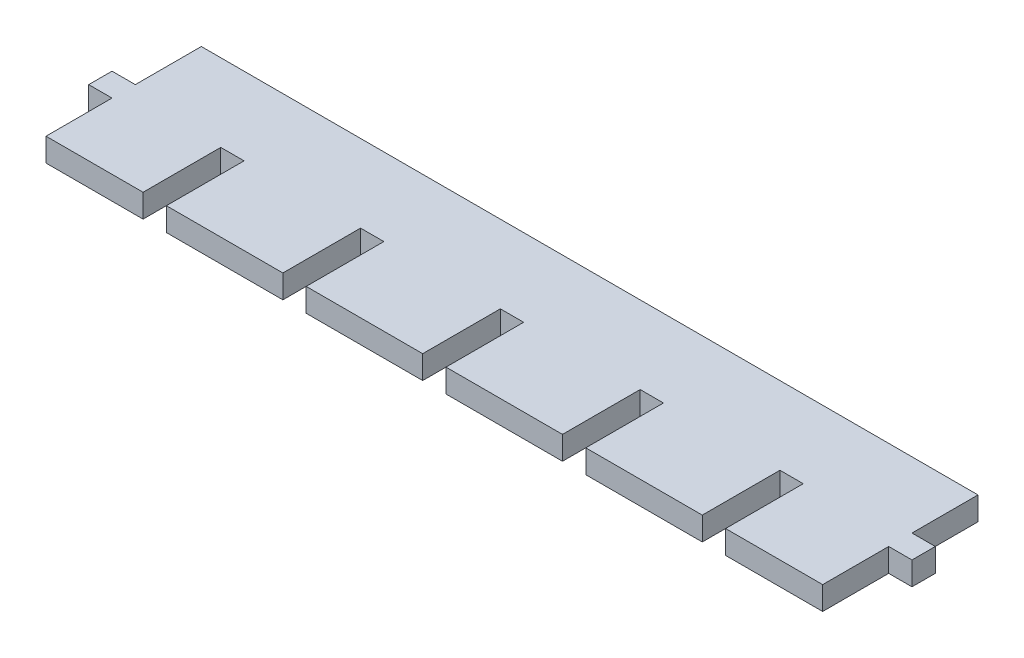
ISO-10303-21;
HEADER;
FILE_DESCRIPTION(('STEP AP214'),'2;1');
FILE_NAME('part.step','',(''),(''),'','','');
FILE_SCHEMA(('AUTOMOTIVE_DESIGN { 1 0 10303 214 1 1 1 1 }'));
ENDSEC;
DATA;
#1=APPLICATION_CONTEXT('core data for automotive mechanical design processes');
#2=APPLICATION_PROTOCOL_DEFINITION('international standard','automotive_design',2000,#1);
#3=PRODUCT_CONTEXT('',#1,'mechanical');
#4=PRODUCT('Part','Part','',(#3));
#5=PRODUCT_RELATED_PRODUCT_CATEGORY('part','',(#4));
#6=PRODUCT_DEFINITION_FORMATION('','',#4);
#7=PRODUCT_DEFINITION_CONTEXT('part definition',#1,'design');
#8=PRODUCT_DEFINITION('design','',#6,#7);
#9=PRODUCT_DEFINITION_SHAPE('','',#8);
#10=(LENGTH_UNIT() NAMED_UNIT(*) SI_UNIT(.MILLI.,.METRE.));
#11=(NAMED_UNIT(*) PLANE_ANGLE_UNIT() SI_UNIT($,.RADIAN.));
#12=(NAMED_UNIT(*) SI_UNIT($,.STERADIAN.) SOLID_ANGLE_UNIT());
#13=UNCERTAINTY_MEASURE_WITH_UNIT(LENGTH_MEASURE(1.E-05),#10,'distance_accuracy_value','');
#14=(GEOMETRIC_REPRESENTATION_CONTEXT(3) GLOBAL_UNCERTAINTY_ASSIGNED_CONTEXT((#13)) GLOBAL_UNIT_ASSIGNED_CONTEXT((#10,
#11,#12)) REPRESENTATION_CONTEXT('',''));
#15=CARTESIAN_POINT('',(0.,0.,0.));
#16=DIRECTION('',(0.,0.,1.));
#17=DIRECTION('',(1.,0.,0.));
#18=AXIS2_PLACEMENT_3D('',#15,#16,#17);
#19=CARTESIAN_POINT('',(0.,6.,0.));
#20=DIRECTION('',(-1.,0.,0.));
#21=DIRECTION('',(0.,0.,1.));
#22=AXIS2_PLACEMENT_3D('',#19,#20,#21);
#23=PLANE('',#22);
#24=DIRECTION('',(0.,0.,-1.));
#25=VECTOR('',#24,1.);
#26=CARTESIAN_POINT('',(0.,0.,0.));
#27=LINE('',#26,#25);
#28=CARTESIAN_POINT('',(0.,0.,0.));
#29=VERTEX_POINT('',#28);
#30=CARTESIAN_POINT('',(0.,0.,-20.));
#31=VERTEX_POINT('',#30);
#32=EDGE_CURVE('E273',#29,#31,#27,.T.);
#33=ORIENTED_EDGE('',*,*,#32,.T.);
#34=DIRECTION('',(0.,-1.,0.));
#35=VECTOR('',#34,1.);
#36=CARTESIAN_POINT('',(0.,6.,-20.));
#37=LINE('',#36,#35);
#38=CARTESIAN_POINT('',(0.,6.,-20.));
#39=VERTEX_POINT('',#38);
#40=EDGE_CURVE('E11',#39,#31,#37,.T.);
#41=ORIENTED_EDGE('',*,*,#40,.F.);
#42=DIRECTION('',(0.,0.,-1.));
#43=VECTOR('',#42,1.);
#44=CARTESIAN_POINT('',(0.,6.,0.));
#45=LINE('',#44,#43);
#46=CARTESIAN_POINT('',(0.,6.,0.));
#47=VERTEX_POINT('',#46);
#48=EDGE_CURVE('E335',#47,#39,#45,.T.);
#49=ORIENTED_EDGE('',*,*,#48,.F.);
#50=DIRECTION('',(0.,-1.,0.));
#51=VECTOR('',#50,1.);
#52=CARTESIAN_POINT('',(0.,6.,0.));
#53=LINE('',#52,#51);
#54=EDGE_CURVE('E269',#47,#29,#53,.T.);
#55=ORIENTED_EDGE('',*,*,#54,.T.);
#56=EDGE_LOOP('',(#33,#41,#49,#55));
#57=FACE_BOUND('',#56,.T.);
#58=ADVANCED_FACE('F33',(#57),#23,.F.);
#59=CARTESIAN_POINT('',(0.,6.,-20.));
#60=DIRECTION('',(0.,0.,-1.));
#61=DIRECTION('',(-1.,0.,0.));
#62=AXIS2_PLACEMENT_3D('',#59,#60,#61);
#63=PLANE('',#62);
#64=DIRECTION('',(1.,0.,0.));
#65=VECTOR('',#64,1.);
#66=CARTESIAN_POINT('',(0.,0.,-20.));
#67=LINE('',#66,#65);
#68=CARTESIAN_POINT('',(6.00000000000001,0.,-20.));
#69=VERTEX_POINT('',#68);
#70=EDGE_CURVE('E276',#31,#69,#67,.T.);
#71=ORIENTED_EDGE('',*,*,#70,.T.);
#72=DIRECTION('',(0.,-1.,0.));
#73=VECTOR('',#72,1.);
#74=CARTESIAN_POINT('',(6.00000000000001,6.,-20.));
#75=LINE('',#74,#73);
#76=CARTESIAN_POINT('',(6.00000000000001,6.,-20.));
#77=VERTEX_POINT('',#76);
#78=EDGE_CURVE('E41',#77,#69,#75,.T.);
#79=ORIENTED_EDGE('',*,*,#78,.F.);
#80=DIRECTION('',(1.,0.,0.));
#81=VECTOR('',#80,1.);
#82=CARTESIAN_POINT('',(0.,6.,-20.));
#83=LINE('',#82,#81);
#84=EDGE_CURVE('E164',#39,#77,#83,.T.);
#85=ORIENTED_EDGE('',*,*,#84,.F.);
#86=ORIENTED_EDGE('',*,*,#40,.T.);
#87=EDGE_LOOP('',(#71,#79,#85,#86));
#88=FACE_BOUND('',#87,.T.);
#89=ADVANCED_FACE('F513',(#88),#63,.F.);
#90=CARTESIAN_POINT('',(6.00000000000001,6.,-20.));
#91=DIRECTION('',(1.,0.,0.));
#92=DIRECTION('',(0.,0.,-1.));
#93=AXIS2_PLACEMENT_3D('',#90,#91,#92);
#94=PLANE('',#93);
#95=DIRECTION('',(0.,0.,1.));
#96=VECTOR('',#95,1.);
#97=CARTESIAN_POINT('',(6.00000000000001,0.,-20.));
#98=LINE('',#97,#96);
#99=CARTESIAN_POINT('',(6.00000000000001,0.,0.));
#100=VERTEX_POINT('',#99);
#101=EDGE_CURVE('E278',#69,#100,#98,.T.);
#102=ORIENTED_EDGE('',*,*,#101,.T.);
#103=DIRECTION('',(0.,-1.,0.));
#104=VECTOR('',#103,1.);
#105=CARTESIAN_POINT('',(6.00000000000001,6.,0.));
#106=LINE('',#105,#104);
#107=CARTESIAN_POINT('',(6.00000000000001,6.,0.));
#108=VERTEX_POINT('',#107);
#109=EDGE_CURVE('E414',#108,#100,#106,.T.);
#110=ORIENTED_EDGE('',*,*,#109,.F.);
#111=DIRECTION('',(0.,0.,1.));
#112=VECTOR('',#111,1.);
#113=CARTESIAN_POINT('',(6.00000000000001,6.,-20.));
#114=LINE('',#113,#112);
#115=EDGE_CURVE('E422',#77,#108,#114,.T.);
#116=ORIENTED_EDGE('',*,*,#115,.F.);
#117=ORIENTED_EDGE('',*,*,#78,.T.);
#118=EDGE_LOOP('',(#102,#110,#116,#117));
#119=FACE_BOUND('',#118,.T.);
#120=ADVANCED_FACE('F420',(#119),#94,.F.);
#121=CARTESIAN_POINT('',(36.,6.,0.));
#122=DIRECTION('',(0.,0.,-1.));
#123=DIRECTION('',(-1.,0.,0.));
#124=AXIS2_PLACEMENT_3D('',#121,#122,#123);
#125=PLANE('',#124);
#126=DIRECTION('',(1.,0.,0.));
#127=VECTOR('',#126,1.);
#128=CARTESIAN_POINT('',(36.,0.,0.));
#129=LINE('',#128,#127);
#130=CARTESIAN_POINT('',(36.,0.,0.));
#131=VERTEX_POINT('',#130);
#132=EDGE_CURVE('E280',#100,#131,#129,.T.);
#133=ORIENTED_EDGE('',*,*,#132,.T.);
#134=DIRECTION('',(0.,-1.,0.));
#135=VECTOR('',#134,1.);
#136=CARTESIAN_POINT('',(36.,6.,0.));
#137=LINE('',#136,#135);
#138=CARTESIAN_POINT('',(36.,6.,0.));
#139=VERTEX_POINT('',#138);
#140=EDGE_CURVE('E411',#139,#131,#137,.T.);
#141=ORIENTED_EDGE('',*,*,#140,.F.);
#142=DIRECTION('',(1.,0.,0.));
#143=VECTOR('',#142,1.);
#144=CARTESIAN_POINT('',(36.,6.,0.));
#145=LINE('',#144,#143);
#146=EDGE_CURVE('E440',#108,#139,#145,.T.);
#147=ORIENTED_EDGE('',*,*,#146,.F.);
#148=ORIENTED_EDGE('',*,*,#109,.T.);
#149=EDGE_LOOP('',(#133,#141,#147,#148));
#150=FACE_BOUND('',#149,.T.);
#151=ADVANCED_FACE('F431',(#150),#125,.F.);
#152=CARTESIAN_POINT('',(36.,6.,-20.));
#153=DIRECTION('',(-1.,0.,0.));
#154=DIRECTION('',(0.,0.,1.));
#155=AXIS2_PLACEMENT_3D('',#152,#153,#154);
#156=PLANE('',#155);
#157=DIRECTION('',(0.,0.,-1.));
#158=VECTOR('',#157,1.);
#159=CARTESIAN_POINT('',(36.,0.,-20.));
#160=LINE('',#159,#158);
#161=CARTESIAN_POINT('',(36.,0.,-20.));
#162=VERTEX_POINT('',#161);
#163=EDGE_CURVE('E282',#131,#162,#160,.T.);
#164=ORIENTED_EDGE('',*,*,#163,.T.);
#165=DIRECTION('',(0.,-1.,0.));
#166=VECTOR('',#165,1.);
#167=CARTESIAN_POINT('',(36.,6.,-20.));
#168=LINE('',#167,#166);
#169=CARTESIAN_POINT('',(36.,6.,-20.));
#170=VERTEX_POINT('',#169);
#171=EDGE_CURVE('E408',#170,#162,#168,.T.);
#172=ORIENTED_EDGE('',*,*,#171,.F.);
#173=DIRECTION('',(0.,0.,-1.));
#174=VECTOR('',#173,1.);
#175=CARTESIAN_POINT('',(36.,6.,-20.));
#176=LINE('',#175,#174);
#177=EDGE_CURVE('E437',#139,#170,#176,.T.);
#178=ORIENTED_EDGE('',*,*,#177,.F.);
#179=ORIENTED_EDGE('',*,*,#140,.T.);
#180=EDGE_LOOP('',(#164,#172,#178,#179));
#181=FACE_BOUND('',#180,.T.);
#182=ADVANCED_FACE('F435',(#181),#156,.F.);
#183=CARTESIAN_POINT('',(42.,6.,-20.));
#184=DIRECTION('',(0.,0.,-1.));
#185=DIRECTION('',(-1.,0.,0.));
#186=AXIS2_PLACEMENT_3D('',#183,#184,#185);
#187=PLANE('',#186);
#188=DIRECTION('',(1.,0.,0.));
#189=VECTOR('',#188,1.);
#190=CARTESIAN_POINT('',(42.,0.,-20.));
#191=LINE('',#190,#189);
#192=CARTESIAN_POINT('',(42.,0.,-20.));
#193=VERTEX_POINT('',#192);
#194=EDGE_CURVE('E284',#162,#193,#191,.T.);
#195=ORIENTED_EDGE('',*,*,#194,.T.);
#196=DIRECTION('',(0.,-1.,0.));
#197=VECTOR('',#196,1.);
#198=CARTESIAN_POINT('',(42.,6.,-20.));
#199=LINE('',#198,#197);
#200=CARTESIAN_POINT('',(42.,6.,-20.));
#201=VERTEX_POINT('',#200);
#202=EDGE_CURVE('E405',#201,#193,#199,.T.);
#203=ORIENTED_EDGE('',*,*,#202,.F.);
#204=DIRECTION('',(1.,0.,0.));
#205=VECTOR('',#204,1.);
#206=CARTESIAN_POINT('',(42.,6.,-20.));
#207=LINE('',#206,#205);
#208=EDGE_CURVE('E439',#170,#201,#207,.T.);
#209=ORIENTED_EDGE('',*,*,#208,.F.);
#210=ORIENTED_EDGE('',*,*,#171,.T.);
#211=EDGE_LOOP('',(#195,#203,#209,#210));
#212=FACE_BOUND('',#211,.T.);
#213=ADVANCED_FACE('F526',(#212),#187,.F.);
#214=CARTESIAN_POINT('',(42.,6.,0.));
#215=DIRECTION('',(1.,0.,0.));
#216=DIRECTION('',(0.,0.,-1.));
#217=AXIS2_PLACEMENT_3D('',#214,#215,#216);
#218=PLANE('',#217);
#219=DIRECTION('',(0.,0.,1.));
#220=VECTOR('',#219,1.);
#221=CARTESIAN_POINT('',(42.,0.,0.));
#222=LINE('',#221,#220);
#223=CARTESIAN_POINT('',(42.,0.,0.));
#224=VERTEX_POINT('',#223);
#225=EDGE_CURVE('E286',#193,#224,#222,.T.);
#226=ORIENTED_EDGE('',*,*,#225,.T.);
#227=DIRECTION('',(0.,-1.,0.));
#228=VECTOR('',#227,1.);
#229=CARTESIAN_POINT('',(42.,6.,0.));
#230=LINE('',#229,#228);
#231=CARTESIAN_POINT('',(42.,6.,0.));
#232=VERTEX_POINT('',#231);
#233=EDGE_CURVE('E402',#232,#224,#230,.T.);
#234=ORIENTED_EDGE('',*,*,#233,.F.);
#235=DIRECTION('',(0.,0.,1.));
#236=VECTOR('',#235,1.);
#237=CARTESIAN_POINT('',(42.,6.,0.));
#238=LINE('',#237,#236);
#239=EDGE_CURVE('E442',#201,#232,#238,.T.);
#240=ORIENTED_EDGE('',*,*,#239,.F.);
#241=ORIENTED_EDGE('',*,*,#202,.T.);
#242=EDGE_LOOP('',(#226,#234,#240,#241));
#243=FACE_BOUND('',#242,.T.);
#244=ADVANCED_FACE('F529',(#243),#218,.F.);
#245=CARTESIAN_POINT('',(72.,6.,0.));
#246=DIRECTION('',(0.,0.,-1.));
#247=DIRECTION('',(-1.,0.,0.));
#248=AXIS2_PLACEMENT_3D('',#245,#246,#247);
#249=PLANE('',#248);
#250=DIRECTION('',(1.,0.,0.));
#251=VECTOR('',#250,1.);
#252=CARTESIAN_POINT('',(72.,0.,0.));
#253=LINE('',#252,#251);
#254=CARTESIAN_POINT('',(72.,0.,0.));
#255=VERTEX_POINT('',#254);
#256=EDGE_CURVE('E288',#224,#255,#253,.T.);
#257=ORIENTED_EDGE('',*,*,#256,.T.);
#258=DIRECTION('',(0.,-1.,0.));
#259=VECTOR('',#258,1.);
#260=CARTESIAN_POINT('',(72.,6.,0.));
#261=LINE('',#260,#259);
#262=CARTESIAN_POINT('',(72.,6.,0.));
#263=VERTEX_POINT('',#262);
#264=EDGE_CURVE('E399',#263,#255,#261,.T.);
#265=ORIENTED_EDGE('',*,*,#264,.F.);
#266=DIRECTION('',(1.,0.,0.));
#267=VECTOR('',#266,1.);
#268=CARTESIAN_POINT('',(72.,6.,0.));
#269=LINE('',#268,#267);
#270=EDGE_CURVE('E448',#232,#263,#269,.T.);
#271=ORIENTED_EDGE('',*,*,#270,.F.);
#272=ORIENTED_EDGE('',*,*,#233,.T.);
#273=EDGE_LOOP('',(#257,#265,#271,#272));
#274=FACE_BOUND('',#273,.T.);
#275=ADVANCED_FACE('F533',(#274),#249,.F.);
#276=CARTESIAN_POINT('',(72.,6.,-20.));
#277=DIRECTION('',(-1.,0.,0.));
#278=DIRECTION('',(0.,0.,1.));
#279=AXIS2_PLACEMENT_3D('',#276,#277,#278);
#280=PLANE('',#279);
#281=DIRECTION('',(0.,0.,-1.));
#282=VECTOR('',#281,1.);
#283=CARTESIAN_POINT('',(72.,0.,-20.));
#284=LINE('',#283,#282);
#285=CARTESIAN_POINT('',(72.,0.,-20.));
#286=VERTEX_POINT('',#285);
#287=EDGE_CURVE('E290',#255,#286,#284,.T.);
#288=ORIENTED_EDGE('',*,*,#287,.T.);
#289=DIRECTION('',(0.,-1.,0.));
#290=VECTOR('',#289,1.);
#291=CARTESIAN_POINT('',(72.,6.,-20.));
#292=LINE('',#291,#290);
#293=CARTESIAN_POINT('',(72.,6.,-20.));
#294=VERTEX_POINT('',#293);
#295=EDGE_CURVE('E396',#294,#286,#292,.T.);
#296=ORIENTED_EDGE('',*,*,#295,.F.);
#297=DIRECTION('',(0.,0.,-1.));
#298=VECTOR('',#297,1.);
#299=CARTESIAN_POINT('',(72.,6.,-20.));
#300=LINE('',#299,#298);
#301=EDGE_CURVE('E450',#263,#294,#300,.T.);
#302=ORIENTED_EDGE('',*,*,#301,.F.);
#303=ORIENTED_EDGE('',*,*,#264,.T.);
#304=EDGE_LOOP('',(#288,#296,#302,#303));
#305=FACE_BOUND('',#304,.T.);
#306=ADVANCED_FACE('F537',(#305),#280,.F.);
#307=CARTESIAN_POINT('',(78.,6.,-20.));
#308=DIRECTION('',(0.,0.,-1.));
#309=DIRECTION('',(-1.,0.,0.));
#310=AXIS2_PLACEMENT_3D('',#307,#308,#309);
#311=PLANE('',#310);
#312=DIRECTION('',(1.,0.,0.));
#313=VECTOR('',#312,1.);
#314=CARTESIAN_POINT('',(78.,0.,-20.));
#315=LINE('',#314,#313);
#316=CARTESIAN_POINT('',(78.,0.,-20.));
#317=VERTEX_POINT('',#316);
#318=EDGE_CURVE('E292',#286,#317,#315,.T.);
#319=ORIENTED_EDGE('',*,*,#318,.T.);
#320=DIRECTION('',(0.,-1.,0.));
#321=VECTOR('',#320,1.);
#322=CARTESIAN_POINT('',(78.,6.,-20.));
#323=LINE('',#322,#321);
#324=CARTESIAN_POINT('',(78.,6.,-20.));
#325=VERTEX_POINT('',#324);
#326=EDGE_CURVE('E393',#325,#317,#323,.T.);
#327=ORIENTED_EDGE('',*,*,#326,.F.);
#328=DIRECTION('',(1.,0.,0.));
#329=VECTOR('',#328,1.);
#330=CARTESIAN_POINT('',(78.,6.,-20.));
#331=LINE('',#330,#329);
#332=EDGE_CURVE('E452',#294,#325,#331,.T.);
#333=ORIENTED_EDGE('',*,*,#332,.F.);
#334=ORIENTED_EDGE('',*,*,#295,.T.);
#335=EDGE_LOOP('',(#319,#327,#333,#334));
#336=FACE_BOUND('',#335,.T.);
#337=ADVANCED_FACE('F541',(#336),#311,.F.);
#338=CARTESIAN_POINT('',(78.,6.,0.));
#339=DIRECTION('',(1.,0.,0.));
#340=DIRECTION('',(0.,0.,-1.));
#341=AXIS2_PLACEMENT_3D('',#338,#339,#340);
#342=PLANE('',#341);
#343=DIRECTION('',(0.,0.,1.));
#344=VECTOR('',#343,1.);
#345=CARTESIAN_POINT('',(78.,0.,0.));
#346=LINE('',#345,#344);
#347=CARTESIAN_POINT('',(78.,0.,0.));
#348=VERTEX_POINT('',#347);
#349=EDGE_CURVE('E294',#317,#348,#346,.T.);
#350=ORIENTED_EDGE('',*,*,#349,.T.);
#351=DIRECTION('',(0.,-1.,0.));
#352=VECTOR('',#351,1.);
#353=CARTESIAN_POINT('',(78.,6.,0.));
#354=LINE('',#353,#352);
#355=CARTESIAN_POINT('',(78.,6.,0.));
#356=VERTEX_POINT('',#355);
#357=EDGE_CURVE('E390',#356,#348,#354,.T.);
#358=ORIENTED_EDGE('',*,*,#357,.F.);
#359=DIRECTION('',(0.,0.,1.));
#360=VECTOR('',#359,1.);
#361=CARTESIAN_POINT('',(78.,6.,0.));
#362=LINE('',#361,#360);
#363=EDGE_CURVE('E454',#325,#356,#362,.T.);
#364=ORIENTED_EDGE('',*,*,#363,.F.);
#365=ORIENTED_EDGE('',*,*,#326,.T.);
#366=EDGE_LOOP('',(#350,#358,#364,#365));
#367=FACE_BOUND('',#366,.T.);
#368=ADVANCED_FACE('F545',(#367),#342,.F.);
#369=CARTESIAN_POINT('',(103.,6.,0.));
#370=DIRECTION('',(0.,0.,-1.));
#371=DIRECTION('',(-1.,0.,0.));
#372=AXIS2_PLACEMENT_3D('',#369,#370,#371);
#373=PLANE('',#372);
#374=DIRECTION('',(1.,0.,0.));
#375=VECTOR('',#374,1.);
#376=CARTESIAN_POINT('',(103.,0.,0.));
#377=LINE('',#376,#375);
#378=CARTESIAN_POINT('',(103.,0.,0.));
#379=VERTEX_POINT('',#378);
#380=EDGE_CURVE('E296',#348,#379,#377,.T.);
#381=ORIENTED_EDGE('',*,*,#380,.T.);
#382=DIRECTION('',(0.,-1.,0.));
#383=VECTOR('',#382,1.);
#384=CARTESIAN_POINT('',(103.,6.,0.));
#385=LINE('',#384,#383);
#386=CARTESIAN_POINT('',(103.,6.,0.));
#387=VERTEX_POINT('',#386);
#388=EDGE_CURVE('E387',#387,#379,#385,.T.);
#389=ORIENTED_EDGE('',*,*,#388,.F.);
#390=DIRECTION('',(1.,0.,0.));
#391=VECTOR('',#390,1.);
#392=CARTESIAN_POINT('',(103.,6.,0.));
#393=LINE('',#392,#391);
#394=EDGE_CURVE('E456',#356,#387,#393,.T.);
#395=ORIENTED_EDGE('',*,*,#394,.F.);
#396=ORIENTED_EDGE('',*,*,#357,.T.);
#397=EDGE_LOOP('',(#381,#389,#395,#396));
#398=FACE_BOUND('',#397,.T.);
#399=ADVANCED_FACE('F549',(#398),#373,.F.);
#400=CARTESIAN_POINT('',(103.,6.,-17.));
#401=DIRECTION('',(-1.,0.,0.));
#402=DIRECTION('',(0.,0.,1.));
#403=AXIS2_PLACEMENT_3D('',#400,#401,#402);
#404=PLANE('',#403);
#405=DIRECTION('',(0.,0.,-1.));
#406=VECTOR('',#405,1.);
#407=CARTESIAN_POINT('',(103.,0.,-17.));
#408=LINE('',#407,#406);
#409=CARTESIAN_POINT('',(103.,0.,-17.));
#410=VERTEX_POINT('',#409);
#411=EDGE_CURVE('E298',#379,#410,#408,.T.);
#412=ORIENTED_EDGE('',*,*,#411,.T.);
#413=DIRECTION('',(0.,-1.,0.));
#414=VECTOR('',#413,1.);
#415=CARTESIAN_POINT('',(103.,6.,-17.));
#416=LINE('',#415,#414);
#417=CARTESIAN_POINT('',(103.,6.,-17.));
#418=VERTEX_POINT('',#417);
#419=EDGE_CURVE('E384',#418,#410,#416,.T.);
#420=ORIENTED_EDGE('',*,*,#419,.F.);
#421=DIRECTION('',(0.,0.,-1.));
#422=VECTOR('',#421,1.);
#423=CARTESIAN_POINT('',(103.,6.,-17.));
#424=LINE('',#423,#422);
#425=EDGE_CURVE('E458',#387,#418,#424,.T.);
#426=ORIENTED_EDGE('',*,*,#425,.F.);
#427=ORIENTED_EDGE('',*,*,#388,.T.);
#428=EDGE_LOOP('',(#412,#420,#426,#427));
#429=FACE_BOUND('',#428,.T.);
#430=ADVANCED_FACE('F553',(#429),#404,.F.);
#431=CARTESIAN_POINT('',(109.,6.,-17.));
#432=DIRECTION('',(0.,0.,-1.));
#433=DIRECTION('',(-1.,0.,0.));
#434=AXIS2_PLACEMENT_3D('',#431,#432,#433);
#435=PLANE('',#434);
#436=DIRECTION('',(1.,0.,0.));
#437=VECTOR('',#436,1.);
#438=CARTESIAN_POINT('',(109.,0.,-17.));
#439=LINE('',#438,#437);
#440=CARTESIAN_POINT('',(109.,0.,-17.));
#441=VERTEX_POINT('',#440);
#442=EDGE_CURVE('E300',#410,#441,#439,.T.);
#443=ORIENTED_EDGE('',*,*,#442,.T.);
#444=DIRECTION('',(0.,-1.,0.));
#445=VECTOR('',#444,1.);
#446=CARTESIAN_POINT('',(109.,6.,-17.));
#447=LINE('',#446,#445);
#448=CARTESIAN_POINT('',(109.,6.,-17.));
#449=VERTEX_POINT('',#448);
#450=EDGE_CURVE('E381',#449,#441,#447,.T.);
#451=ORIENTED_EDGE('',*,*,#450,.F.);
#452=DIRECTION('',(1.,0.,0.));
#453=VECTOR('',#452,1.);
#454=CARTESIAN_POINT('',(109.,6.,-17.));
#455=LINE('',#454,#453);
#456=EDGE_CURVE('E460',#418,#449,#455,.T.);
#457=ORIENTED_EDGE('',*,*,#456,.F.);
#458=ORIENTED_EDGE('',*,*,#419,.T.);
#459=EDGE_LOOP('',(#443,#451,#457,#458));
#460=FACE_BOUND('',#459,.T.);
#461=ADVANCED_FACE('F557',(#460),#435,.F.);
#462=CARTESIAN_POINT('',(109.,6.,-23.));
#463=DIRECTION('',(-1.,0.,0.));
#464=DIRECTION('',(0.,0.,1.));
#465=AXIS2_PLACEMENT_3D('',#462,#463,#464);
#466=PLANE('',#465);
#467=DIRECTION('',(0.,0.,-1.));
#468=VECTOR('',#467,1.);
#469=CARTESIAN_POINT('',(109.,0.,-23.));
#470=LINE('',#469,#468);
#471=CARTESIAN_POINT('',(109.,0.,-23.));
#472=VERTEX_POINT('',#471);
#473=EDGE_CURVE('E302',#441,#472,#470,.T.);
#474=ORIENTED_EDGE('',*,*,#473,.T.);
#475=DIRECTION('',(0.,-1.,0.));
#476=VECTOR('',#475,1.);
#477=CARTESIAN_POINT('',(109.,6.,-23.));
#478=LINE('',#477,#476);
#479=CARTESIAN_POINT('',(109.,6.,-23.));
#480=VERTEX_POINT('',#479);
#481=EDGE_CURVE('E378',#480,#472,#478,.T.);
#482=ORIENTED_EDGE('',*,*,#481,.F.);
#483=DIRECTION('',(0.,0.,-1.));
#484=VECTOR('',#483,1.);
#485=CARTESIAN_POINT('',(109.,6.,-23.));
#486=LINE('',#485,#484);
#487=EDGE_CURVE('E462',#449,#480,#486,.T.);
#488=ORIENTED_EDGE('',*,*,#487,.F.);
#489=ORIENTED_EDGE('',*,*,#450,.T.);
#490=EDGE_LOOP('',(#474,#482,#488,#489));
#491=FACE_BOUND('',#490,.T.);
#492=ADVANCED_FACE('F561',(#491),#466,.F.);
#493=CARTESIAN_POINT('',(103.,6.,-23.));
#494=DIRECTION('',(0.,0.,1.));
#495=DIRECTION('',(1.,0.,0.));
#496=AXIS2_PLACEMENT_3D('',#493,#494,#495);
#497=PLANE('',#496);
#498=DIRECTION('',(-1.,0.,0.));
#499=VECTOR('',#498,1.);
#500=CARTESIAN_POINT('',(103.,0.,-23.));
#501=LINE('',#500,#499);
#502=CARTESIAN_POINT('',(103.,0.,-23.));
#503=VERTEX_POINT('',#502);
#504=EDGE_CURVE('E304',#472,#503,#501,.T.);
#505=ORIENTED_EDGE('',*,*,#504,.T.);
#506=DIRECTION('',(0.,-1.,0.));
#507=VECTOR('',#506,1.);
#508=CARTESIAN_POINT('',(103.,6.,-23.));
#509=LINE('',#508,#507);
#510=CARTESIAN_POINT('',(103.,6.,-23.));
#511=VERTEX_POINT('',#510);
#512=EDGE_CURVE('E375',#511,#503,#509,.T.);
#513=ORIENTED_EDGE('',*,*,#512,.F.);
#514=DIRECTION('',(-1.,0.,0.));
#515=VECTOR('',#514,1.);
#516=CARTESIAN_POINT('',(103.,6.,-23.));
#517=LINE('',#516,#515);
#518=EDGE_CURVE('E464',#480,#511,#517,.T.);
#519=ORIENTED_EDGE('',*,*,#518,.F.);
#520=ORIENTED_EDGE('',*,*,#481,.T.);
#521=EDGE_LOOP('',(#505,#513,#519,#520));
#522=FACE_BOUND('',#521,.T.);
#523=ADVANCED_FACE('F565',(#522),#497,.F.);
#524=CARTESIAN_POINT('',(103.,6.,-40.));
#525=DIRECTION('',(-1.,0.,0.));
#526=DIRECTION('',(0.,0.,1.));
#527=AXIS2_PLACEMENT_3D('',#524,#525,#526);
#528=PLANE('',#527);
#529=DIRECTION('',(0.,0.,-1.));
#530=VECTOR('',#529,1.);
#531=CARTESIAN_POINT('',(103.,0.,-40.));
#532=LINE('',#531,#530);
#533=CARTESIAN_POINT('',(103.,0.,-40.));
#534=VERTEX_POINT('',#533);
#535=EDGE_CURVE('E306',#503,#534,#532,.T.);
#536=ORIENTED_EDGE('',*,*,#535,.T.);
#537=DIRECTION('',(0.,-1.,0.));
#538=VECTOR('',#537,1.);
#539=CARTESIAN_POINT('',(103.,6.,-40.));
#540=LINE('',#539,#538);
#541=CARTESIAN_POINT('',(103.,6.,-40.));
#542=VERTEX_POINT('',#541);
#543=EDGE_CURVE('E372',#542,#534,#540,.T.);
#544=ORIENTED_EDGE('',*,*,#543,.F.);
#545=DIRECTION('',(0.,0.,-1.));
#546=VECTOR('',#545,1.);
#547=CARTESIAN_POINT('',(103.,6.,-40.));
#548=LINE('',#547,#546);
#549=EDGE_CURVE('E466',#511,#542,#548,.T.);
#550=ORIENTED_EDGE('',*,*,#549,.F.);
#551=ORIENTED_EDGE('',*,*,#512,.T.);
#552=EDGE_LOOP('',(#536,#544,#550,#551));
#553=FACE_BOUND('',#552,.T.);
#554=ADVANCED_FACE('F569',(#553),#528,.F.);
#555=CARTESIAN_POINT('',(-97.,6.,-40.));
#556=DIRECTION('',(0.,0.,1.));
#557=DIRECTION('',(1.,0.,0.));
#558=AXIS2_PLACEMENT_3D('',#555,#556,#557);
#559=PLANE('',#558);
#560=DIRECTION('',(-1.,0.,0.));
#561=VECTOR('',#560,1.);
#562=CARTESIAN_POINT('',(-97.,0.,-40.));
#563=LINE('',#562,#561);
#564=CARTESIAN_POINT('',(-97.,0.,-40.));
#565=VERTEX_POINT('',#564);
#566=EDGE_CURVE('E308',#534,#565,#563,.T.);
#567=ORIENTED_EDGE('',*,*,#566,.T.);
#568=DIRECTION('',(0.,-1.,0.));
#569=VECTOR('',#568,1.);
#570=CARTESIAN_POINT('',(-97.,6.,-40.));
#571=LINE('',#570,#569);
#572=CARTESIAN_POINT('',(-97.,6.,-40.));
#573=VERTEX_POINT('',#572);
#574=EDGE_CURVE('E369',#573,#565,#571,.T.);
#575=ORIENTED_EDGE('',*,*,#574,.F.);
#576=DIRECTION('',(-1.,0.,0.));
#577=VECTOR('',#576,1.);
#578=CARTESIAN_POINT('',(-97.,6.,-40.));
#579=LINE('',#578,#577);
#580=EDGE_CURVE('E468',#542,#573,#579,.T.);
#581=ORIENTED_EDGE('',*,*,#580,.F.);
#582=ORIENTED_EDGE('',*,*,#543,.T.);
#583=EDGE_LOOP('',(#567,#575,#581,#582));
#584=FACE_BOUND('',#583,.T.);
#585=ADVANCED_FACE('F573',(#584),#559,.F.);
#586=CARTESIAN_POINT('',(-97.,6.,-23.));
#587=DIRECTION('',(1.,0.,0.));
#588=DIRECTION('',(0.,0.,-1.));
#589=AXIS2_PLACEMENT_3D('',#586,#587,#588);
#590=PLANE('',#589);
#591=DIRECTION('',(0.,0.,1.));
#592=VECTOR('',#591,1.);
#593=CARTESIAN_POINT('',(-97.,0.,-23.));
#594=LINE('',#593,#592);
#595=CARTESIAN_POINT('',(-97.,0.,-23.));
#596=VERTEX_POINT('',#595);
#597=EDGE_CURVE('E310',#565,#596,#594,.T.);
#598=ORIENTED_EDGE('',*,*,#597,.T.);
#599=DIRECTION('',(0.,-1.,0.));
#600=VECTOR('',#599,1.);
#601=CARTESIAN_POINT('',(-97.,6.,-23.));
#602=LINE('',#601,#600);
#603=CARTESIAN_POINT('',(-97.,6.,-23.));
#604=VERTEX_POINT('',#603);
#605=EDGE_CURVE('E366',#604,#596,#602,.T.);
#606=ORIENTED_EDGE('',*,*,#605,.F.);
#607=DIRECTION('',(0.,0.,1.));
#608=VECTOR('',#607,1.);
#609=CARTESIAN_POINT('',(-97.,6.,-23.));
#610=LINE('',#609,#608);
#611=EDGE_CURVE('E470',#573,#604,#610,.T.);
#612=ORIENTED_EDGE('',*,*,#611,.F.);
#613=ORIENTED_EDGE('',*,*,#574,.T.);
#614=EDGE_LOOP('',(#598,#606,#612,#613));
#615=FACE_BOUND('',#614,.T.);
#616=ADVANCED_FACE('F577',(#615),#590,.F.);
#617=CARTESIAN_POINT('',(-97.,6.,-23.));
#618=DIRECTION('',(0.,0.,1.));
#619=DIRECTION('',(1.,0.,0.));
#620=AXIS2_PLACEMENT_3D('',#617,#618,#619);
#621=PLANE('',#620);
#622=DIRECTION('',(-1.,0.,0.));
#623=VECTOR('',#622,1.);
#624=CARTESIAN_POINT('',(-97.,0.,-23.));
#625=LINE('',#624,#623);
#626=CARTESIAN_POINT('',(-103.,0.,-23.));
#627=VERTEX_POINT('',#626);
#628=EDGE_CURVE('E312',#596,#627,#625,.T.);
#629=ORIENTED_EDGE('',*,*,#628,.T.);
#630=DIRECTION('',(0.,-1.,0.));
#631=VECTOR('',#630,1.);
#632=CARTESIAN_POINT('',(-103.,6.,-23.));
#633=LINE('',#632,#631);
#634=CARTESIAN_POINT('',(-103.,6.,-23.));
#635=VERTEX_POINT('',#634);
#636=EDGE_CURVE('E363',#635,#627,#633,.T.);
#637=ORIENTED_EDGE('',*,*,#636,.F.);
#638=DIRECTION('',(-1.,0.,0.));
#639=VECTOR('',#638,1.);
#640=CARTESIAN_POINT('',(-97.,6.,-23.));
#641=LINE('',#640,#639);
#642=EDGE_CURVE('E472',#604,#635,#641,.T.);
#643=ORIENTED_EDGE('',*,*,#642,.F.);
#644=ORIENTED_EDGE('',*,*,#605,.T.);
#645=EDGE_LOOP('',(#629,#637,#643,#644));
#646=FACE_BOUND('',#645,.T.);
#647=ADVANCED_FACE('F581',(#646),#621,.F.);
#648=CARTESIAN_POINT('',(-103.,6.,-23.));
#649=DIRECTION('',(1.,0.,0.));
#650=DIRECTION('',(0.,0.,-1.));
#651=AXIS2_PLACEMENT_3D('',#648,#649,#650);
#652=PLANE('',#651);
#653=DIRECTION('',(0.,0.,1.));
#654=VECTOR('',#653,1.);
#655=CARTESIAN_POINT('',(-103.,0.,-23.));
#656=LINE('',#655,#654);
#657=CARTESIAN_POINT('',(-103.,0.,-17.));
#658=VERTEX_POINT('',#657);
#659=EDGE_CURVE('E314',#627,#658,#656,.T.);
#660=ORIENTED_EDGE('',*,*,#659,.T.);
#661=DIRECTION('',(0.,-1.,0.));
#662=VECTOR('',#661,1.);
#663=CARTESIAN_POINT('',(-103.,6.,-17.));
#664=LINE('',#663,#662);
#665=CARTESIAN_POINT('',(-103.,6.,-17.));
#666=VERTEX_POINT('',#665);
#667=EDGE_CURVE('E360',#666,#658,#664,.T.);
#668=ORIENTED_EDGE('',*,*,#667,.F.);
#669=DIRECTION('',(0.,0.,1.));
#670=VECTOR('',#669,1.);
#671=CARTESIAN_POINT('',(-103.,6.,-23.));
#672=LINE('',#671,#670);
#673=EDGE_CURVE('E474',#635,#666,#672,.T.);
#674=ORIENTED_EDGE('',*,*,#673,.F.);
#675=ORIENTED_EDGE('',*,*,#636,.T.);
#676=EDGE_LOOP('',(#660,#668,#674,#675));
#677=FACE_BOUND('',#676,.T.);
#678=ADVANCED_FACE('F585',(#677),#652,.F.);
#679=CARTESIAN_POINT('',(-103.,6.,-17.));
#680=DIRECTION('',(0.,0.,-1.));
#681=DIRECTION('',(-1.,0.,0.));
#682=AXIS2_PLACEMENT_3D('',#679,#680,#681);
#683=PLANE('',#682);
#684=DIRECTION('',(1.,0.,0.));
#685=VECTOR('',#684,1.);
#686=CARTESIAN_POINT('',(-103.,0.,-17.));
#687=LINE('',#686,#685);
#688=CARTESIAN_POINT('',(-97.,0.,-17.));
#689=VERTEX_POINT('',#688);
#690=EDGE_CURVE('E316',#658,#689,#687,.T.);
#691=ORIENTED_EDGE('',*,*,#690,.T.);
#692=DIRECTION('',(0.,-1.,0.));
#693=VECTOR('',#692,1.);
#694=CARTESIAN_POINT('',(-97.,6.,-17.));
#695=LINE('',#694,#693);
#696=CARTESIAN_POINT('',(-97.,6.,-17.));
#697=VERTEX_POINT('',#696);
#698=EDGE_CURVE('E357',#697,#689,#695,.T.);
#699=ORIENTED_EDGE('',*,*,#698,.F.);
#700=DIRECTION('',(1.,0.,0.));
#701=VECTOR('',#700,1.);
#702=CARTESIAN_POINT('',(-103.,6.,-17.));
#703=LINE('',#702,#701);
#704=EDGE_CURVE('E476',#666,#697,#703,.T.);
#705=ORIENTED_EDGE('',*,*,#704,.F.);
#706=ORIENTED_EDGE('',*,*,#667,.T.);
#707=EDGE_LOOP('',(#691,#699,#705,#706));
#708=FACE_BOUND('',#707,.T.);
#709=ADVANCED_FACE('F589',(#708),#683,.F.);
#710=CARTESIAN_POINT('',(-97.,6.,0.));
#711=DIRECTION('',(1.,0.,0.));
#712=DIRECTION('',(0.,0.,-1.));
#713=AXIS2_PLACEMENT_3D('',#710,#711,#712);
#714=PLANE('',#713);
#715=DIRECTION('',(0.,0.,1.));
#716=VECTOR('',#715,1.);
#717=CARTESIAN_POINT('',(-97.,0.,0.));
#718=LINE('',#717,#716);
#719=CARTESIAN_POINT('',(-97.,0.,0.));
#720=VERTEX_POINT('',#719);
#721=EDGE_CURVE('E318',#689,#720,#718,.T.);
#722=ORIENTED_EDGE('',*,*,#721,.T.);
#723=DIRECTION('',(0.,-1.,0.));
#724=VECTOR('',#723,1.);
#725=CARTESIAN_POINT('',(-97.,6.,0.));
#726=LINE('',#725,#724);
#727=CARTESIAN_POINT('',(-97.,6.,0.));
#728=VERTEX_POINT('',#727);
#729=EDGE_CURVE('E354',#728,#720,#726,.T.);
#730=ORIENTED_EDGE('',*,*,#729,.F.);
#731=DIRECTION('',(0.,0.,1.));
#732=VECTOR('',#731,1.);
#733=CARTESIAN_POINT('',(-97.,6.,0.));
#734=LINE('',#733,#732);
#735=EDGE_CURVE('E478',#697,#728,#734,.T.);
#736=ORIENTED_EDGE('',*,*,#735,.F.);
#737=ORIENTED_EDGE('',*,*,#698,.T.);
#738=EDGE_LOOP('',(#722,#730,#736,#737));
#739=FACE_BOUND('',#738,.T.);
#740=ADVANCED_FACE('F593',(#739),#714,.F.);
#741=CARTESIAN_POINT('',(-72.,6.,0.));
#742=DIRECTION('',(0.,0.,-1.));
#743=DIRECTION('',(-1.,0.,0.));
#744=AXIS2_PLACEMENT_3D('',#741,#742,#743);
#745=PLANE('',#744);
#746=DIRECTION('',(1.,0.,0.));
#747=VECTOR('',#746,1.);
#748=CARTESIAN_POINT('',(-72.,0.,0.));
#749=LINE('',#748,#747);
#750=CARTESIAN_POINT('',(-72.,0.,0.));
#751=VERTEX_POINT('',#750);
#752=EDGE_CURVE('E320',#720,#751,#749,.T.);
#753=ORIENTED_EDGE('',*,*,#752,.T.);
#754=DIRECTION('',(0.,-1.,0.));
#755=VECTOR('',#754,1.);
#756=CARTESIAN_POINT('',(-72.,6.,0.));
#757=LINE('',#756,#755);
#758=CARTESIAN_POINT('',(-72.,6.,0.));
#759=VERTEX_POINT('',#758);
#760=EDGE_CURVE('E351',#759,#751,#757,.T.);
#761=ORIENTED_EDGE('',*,*,#760,.F.);
#762=DIRECTION('',(1.,0.,0.));
#763=VECTOR('',#762,1.);
#764=CARTESIAN_POINT('',(-72.,6.,0.));
#765=LINE('',#764,#763);
#766=EDGE_CURVE('E480',#728,#759,#765,.T.);
#767=ORIENTED_EDGE('',*,*,#766,.F.);
#768=ORIENTED_EDGE('',*,*,#729,.T.);
#769=EDGE_LOOP('',(#753,#761,#767,#768));
#770=FACE_BOUND('',#769,.T.);
#771=ADVANCED_FACE('F597',(#770),#745,.F.);
#772=CARTESIAN_POINT('',(-72.,6.,0.));
#773=DIRECTION('',(-1.,0.,0.));
#774=DIRECTION('',(0.,0.,1.));
#775=AXIS2_PLACEMENT_3D('',#772,#773,#774);
#776=PLANE('',#775);
#777=DIRECTION('',(0.,0.,-1.));
#778=VECTOR('',#777,1.);
#779=CARTESIAN_POINT('',(-72.,0.,0.));
#780=LINE('',#779,#778);
#781=CARTESIAN_POINT('',(-72.,0.,-20.));
#782=VERTEX_POINT('',#781);
#783=EDGE_CURVE('E322',#751,#782,#780,.T.);
#784=ORIENTED_EDGE('',*,*,#783,.T.);
#785=DIRECTION('',(0.,-1.,0.));
#786=VECTOR('',#785,1.);
#787=CARTESIAN_POINT('',(-72.,6.,-20.));
#788=LINE('',#787,#786);
#789=CARTESIAN_POINT('',(-72.,6.,-20.));
#790=VERTEX_POINT('',#789);
#791=EDGE_CURVE('E348',#790,#782,#788,.T.);
#792=ORIENTED_EDGE('',*,*,#791,.F.);
#793=DIRECTION('',(0.,0.,-1.));
#794=VECTOR('',#793,1.);
#795=CARTESIAN_POINT('',(-72.,6.,0.));
#796=LINE('',#795,#794);
#797=EDGE_CURVE('E482',#759,#790,#796,.T.);
#798=ORIENTED_EDGE('',*,*,#797,.F.);
#799=ORIENTED_EDGE('',*,*,#760,.T.);
#800=EDGE_LOOP('',(#784,#792,#798,#799));
#801=FACE_BOUND('',#800,.T.);
#802=ADVANCED_FACE('F601',(#801),#776,.F.);
#803=CARTESIAN_POINT('',(-72.,6.,-20.));
#804=DIRECTION('',(0.,0.,-1.));
#805=DIRECTION('',(-1.,0.,0.));
#806=AXIS2_PLACEMENT_3D('',#803,#804,#805);
#807=PLANE('',#806);
#808=DIRECTION('',(1.,0.,0.));
#809=VECTOR('',#808,1.);
#810=CARTESIAN_POINT('',(-72.,0.,-20.));
#811=LINE('',#810,#809);
#812=CARTESIAN_POINT('',(-66.,0.,-20.));
#813=VERTEX_POINT('',#812);
#814=EDGE_CURVE('E324',#782,#813,#811,.T.);
#815=ORIENTED_EDGE('',*,*,#814,.T.);
#816=DIRECTION('',(0.,-1.,0.));
#817=VECTOR('',#816,1.);
#818=CARTESIAN_POINT('',(-66.,6.,-20.));
#819=LINE('',#818,#817);
#820=CARTESIAN_POINT('',(-66.,6.,-20.));
#821=VERTEX_POINT('',#820);
#822=EDGE_CURVE('E345',#821,#813,#819,.T.);
#823=ORIENTED_EDGE('',*,*,#822,.F.);
#824=DIRECTION('',(1.,0.,0.));
#825=VECTOR('',#824,1.);
#826=CARTESIAN_POINT('',(-72.,6.,-20.));
#827=LINE('',#826,#825);
#828=EDGE_CURVE('E484',#790,#821,#827,.T.);
#829=ORIENTED_EDGE('',*,*,#828,.F.);
#830=ORIENTED_EDGE('',*,*,#791,.T.);
#831=EDGE_LOOP('',(#815,#823,#829,#830));
#832=FACE_BOUND('',#831,.T.);
#833=ADVANCED_FACE('F605',(#832),#807,.F.);
#834=CARTESIAN_POINT('',(-66.,6.,-20.));
#835=DIRECTION('',(1.,0.,0.));
#836=DIRECTION('',(0.,0.,-1.));
#837=AXIS2_PLACEMENT_3D('',#834,#835,#836);
#838=PLANE('',#837);
#839=DIRECTION('',(0.,0.,1.));
#840=VECTOR('',#839,1.);
#841=CARTESIAN_POINT('',(-66.,0.,-20.));
#842=LINE('',#841,#840);
#843=CARTESIAN_POINT('',(-66.,0.,0.));
#844=VERTEX_POINT('',#843);
#845=EDGE_CURVE('E326',#813,#844,#842,.T.);
#846=ORIENTED_EDGE('',*,*,#845,.T.);
#847=DIRECTION('',(0.,-1.,0.));
#848=VECTOR('',#847,1.);
#849=CARTESIAN_POINT('',(-66.,6.,0.));
#850=LINE('',#849,#848);
#851=CARTESIAN_POINT('',(-66.,6.,0.));
#852=VERTEX_POINT('',#851);
#853=EDGE_CURVE('E342',#852,#844,#850,.T.);
#854=ORIENTED_EDGE('',*,*,#853,.F.);
#855=DIRECTION('',(0.,0.,1.));
#856=VECTOR('',#855,1.);
#857=CARTESIAN_POINT('',(-66.,6.,-20.));
#858=LINE('',#857,#856);
#859=EDGE_CURVE('E486',#821,#852,#858,.T.);
#860=ORIENTED_EDGE('',*,*,#859,.F.);
#861=ORIENTED_EDGE('',*,*,#822,.T.);
#862=EDGE_LOOP('',(#846,#854,#860,#861));
#863=FACE_BOUND('',#862,.T.);
#864=ADVANCED_FACE('F609',(#863),#838,.F.);
#865=CARTESIAN_POINT('',(-36.,6.,0.));
#866=DIRECTION('',(0.,0.,-1.));
#867=DIRECTION('',(-1.,0.,0.));
#868=AXIS2_PLACEMENT_3D('',#865,#866,#867);
#869=PLANE('',#868);
#870=DIRECTION('',(1.,0.,0.));
#871=VECTOR('',#870,1.);
#872=CARTESIAN_POINT('',(-36.,0.,0.));
#873=LINE('',#872,#871);
#874=CARTESIAN_POINT('',(-36.,0.,0.));
#875=VERTEX_POINT('',#874);
#876=EDGE_CURVE('E328',#844,#875,#873,.T.);
#877=ORIENTED_EDGE('',*,*,#876,.T.);
#878=DIRECTION('',(0.,-1.,0.));
#879=VECTOR('',#878,1.);
#880=CARTESIAN_POINT('',(-36.,6.,0.));
#881=LINE('',#880,#879);
#882=CARTESIAN_POINT('',(-36.,6.,0.));
#883=VERTEX_POINT('',#882);
#884=EDGE_CURVE('E339',#883,#875,#881,.T.);
#885=ORIENTED_EDGE('',*,*,#884,.F.);
#886=DIRECTION('',(1.,0.,0.));
#887=VECTOR('',#886,1.);
#888=CARTESIAN_POINT('',(-36.,6.,0.));
#889=LINE('',#888,#887);
#890=EDGE_CURVE('E488',#852,#883,#889,.T.);
#891=ORIENTED_EDGE('',*,*,#890,.F.);
#892=ORIENTED_EDGE('',*,*,#853,.T.);
#893=EDGE_LOOP('',(#877,#885,#891,#892));
#894=FACE_BOUND('',#893,.T.);
#895=ADVANCED_FACE('F494',(#894),#869,.F.);
#896=CARTESIAN_POINT('',(-36.,6.,0.));
#897=DIRECTION('',(-1.,0.,0.));
#898=DIRECTION('',(0.,0.,1.));
#899=AXIS2_PLACEMENT_3D('',#896,#897,#898);
#900=PLANE('',#899);
#901=DIRECTION('',(0.,0.,-1.));
#902=VECTOR('',#901,1.);
#903=CARTESIAN_POINT('',(-36.,0.,0.));
#904=LINE('',#903,#902);
#905=CARTESIAN_POINT('',(-36.,0.,-20.));
#906=VERTEX_POINT('',#905);
#907=EDGE_CURVE('E330',#875,#906,#904,.T.);
#908=ORIENTED_EDGE('',*,*,#907,.T.);
#909=DIRECTION('',(0.,-1.,0.));
#910=VECTOR('',#909,1.);
#911=CARTESIAN_POINT('',(-36.,6.,-20.));
#912=LINE('',#911,#910);
#913=CARTESIAN_POINT('',(-36.,6.,-20.));
#914=VERTEX_POINT('',#913);
#915=EDGE_CURVE('E264',#914,#906,#912,.T.);
#916=ORIENTED_EDGE('',*,*,#915,.F.);
#917=DIRECTION('',(0.,0.,-1.));
#918=VECTOR('',#917,1.);
#919=CARTESIAN_POINT('',(-36.,6.,0.));
#920=LINE('',#919,#918);
#921=EDGE_CURVE('E255',#883,#914,#920,.T.);
#922=ORIENTED_EDGE('',*,*,#921,.F.);
#923=ORIENTED_EDGE('',*,*,#884,.T.);
#924=EDGE_LOOP('',(#908,#916,#922,#923));
#925=FACE_BOUND('',#924,.T.);
#926=ADVANCED_FACE('F498',(#925),#900,.F.);
#927=CARTESIAN_POINT('',(-36.,6.,-20.));
#928=DIRECTION('',(0.,0.,-1.));
#929=DIRECTION('',(-1.,0.,0.));
#930=AXIS2_PLACEMENT_3D('',#927,#928,#929);
#931=PLANE('',#930);
#932=DIRECTION('',(1.,0.,0.));
#933=VECTOR('',#932,1.);
#934=CARTESIAN_POINT('',(-36.,0.,-20.));
#935=LINE('',#934,#933);
#936=CARTESIAN_POINT('',(-30.,0.,-20.));
#937=VERTEX_POINT('',#936);
#938=EDGE_CURVE('E263',#906,#937,#935,.T.);
#939=ORIENTED_EDGE('',*,*,#938,.T.);
#940=DIRECTION('',(0.,-1.,0.));
#941=VECTOR('',#940,1.);
#942=CARTESIAN_POINT('',(-30.,6.,-20.));
#943=LINE('',#942,#941);
#944=CARTESIAN_POINT('',(-30.,6.,-20.));
#945=VERTEX_POINT('',#944);
#946=EDGE_CURVE('E260',#945,#937,#943,.T.);
#947=ORIENTED_EDGE('',*,*,#946,.F.);
#948=DIRECTION('',(1.,0.,0.));
#949=VECTOR('',#948,1.);
#950=CARTESIAN_POINT('',(-36.,6.,-20.));
#951=LINE('',#950,#949);
#952=EDGE_CURVE('E249',#914,#945,#951,.T.);
#953=ORIENTED_EDGE('',*,*,#952,.F.);
#954=ORIENTED_EDGE('',*,*,#915,.T.);
#955=EDGE_LOOP('',(#939,#947,#953,#954));
#956=FACE_BOUND('',#955,.T.);
#957=ADVANCED_FACE('F261',(#956),#931,.F.);
#958=CARTESIAN_POINT('',(-30.,6.,-20.));
#959=DIRECTION('',(1.,0.,0.));
#960=DIRECTION('',(0.,0.,-1.));
#961=AXIS2_PLACEMENT_3D('',#958,#959,#960);
#962=PLANE('',#961);
#963=DIRECTION('',(0.,0.,1.));
#964=VECTOR('',#963,1.);
#965=CARTESIAN_POINT('',(-30.,0.,-20.));
#966=LINE('',#965,#964);
#967=CARTESIAN_POINT('',(-30.,0.,0.));
#968=VERTEX_POINT('',#967);
#969=EDGE_CURVE('E150',#937,#968,#966,.T.);
#970=ORIENTED_EDGE('',*,*,#969,.T.);
#971=DIRECTION('',(0.,-1.,0.));
#972=VECTOR('',#971,1.);
#973=CARTESIAN_POINT('',(-30.,6.,0.));
#974=LINE('',#973,#972);
#975=CARTESIAN_POINT('',(-30.,6.,0.));
#976=VERTEX_POINT('',#975);
#977=EDGE_CURVE('E265',#976,#968,#974,.T.);
#978=ORIENTED_EDGE('',*,*,#977,.F.);
#979=DIRECTION('',(0.,0.,1.));
#980=VECTOR('',#979,1.);
#981=CARTESIAN_POINT('',(-30.,6.,-20.));
#982=LINE('',#981,#980);
#983=EDGE_CURVE('E253',#945,#976,#982,.T.);
#984=ORIENTED_EDGE('',*,*,#983,.F.);
#985=ORIENTED_EDGE('',*,*,#946,.T.);
#986=EDGE_LOOP('',(#970,#978,#984,#985));
#987=FACE_BOUND('',#986,.T.);
#988=ADVANCED_FACE('F267',(#987),#962,.F.);
#989=CARTESIAN_POINT('',(0.,6.,0.));
#990=DIRECTION('',(0.,0.,-1.));
#991=DIRECTION('',(-1.,0.,0.));
#992=AXIS2_PLACEMENT_3D('',#989,#990,#991);
#993=PLANE('',#992);
#994=DIRECTION('',(1.,0.,0.));
#995=VECTOR('',#994,1.);
#996=CARTESIAN_POINT('',(0.,0.,0.));
#997=LINE('',#996,#995);
#998=EDGE_CURVE('E156',#968,#29,#997,.T.);
#999=ORIENTED_EDGE('',*,*,#998,.T.);
#1000=ORIENTED_EDGE('',*,*,#54,.F.);
#1001=DIRECTION('',(1.,0.,0.));
#1002=VECTOR('',#1001,1.);
#1003=CARTESIAN_POINT('',(0.,6.,0.));
#1004=LINE('',#1003,#1002);
#1005=EDGE_CURVE('E49',#976,#47,#1004,.T.);
#1006=ORIENTED_EDGE('',*,*,#1005,.F.);
#1007=ORIENTED_EDGE('',*,*,#977,.T.);
#1008=EDGE_LOOP('',(#999,#1000,#1006,#1007));
#1009=FACE_BOUND('',#1008,.T.);
#1010=ADVANCED_FACE('F502',(#1009),#993,.F.);
#1011=CARTESIAN_POINT('',(0.,6.,0.));
#1012=DIRECTION('',(0.,-1.,0.));
#1013=DIRECTION('',(0.,0.,-1.));
#1014=AXIS2_PLACEMENT_3D('',#1011,#1012,#1013);
#1015=PLANE('',#1014);
#1016=ORIENTED_EDGE('',*,*,#48,.T.);
#1017=ORIENTED_EDGE('',*,*,#84,.T.);
#1018=ORIENTED_EDGE('',*,*,#115,.T.);
#1019=ORIENTED_EDGE('',*,*,#146,.T.);
#1020=ORIENTED_EDGE('',*,*,#177,.T.);
#1021=ORIENTED_EDGE('',*,*,#208,.T.);
#1022=ORIENTED_EDGE('',*,*,#239,.T.);
#1023=ORIENTED_EDGE('',*,*,#270,.T.);
#1024=ORIENTED_EDGE('',*,*,#301,.T.);
#1025=ORIENTED_EDGE('',*,*,#332,.T.);
#1026=ORIENTED_EDGE('',*,*,#363,.T.);
#1027=ORIENTED_EDGE('',*,*,#394,.T.);
#1028=ORIENTED_EDGE('',*,*,#425,.T.);
#1029=ORIENTED_EDGE('',*,*,#456,.T.);
#1030=ORIENTED_EDGE('',*,*,#487,.T.);
#1031=ORIENTED_EDGE('',*,*,#518,.T.);
#1032=ORIENTED_EDGE('',*,*,#549,.T.);
#1033=ORIENTED_EDGE('',*,*,#580,.T.);
#1034=ORIENTED_EDGE('',*,*,#611,.T.);
#1035=ORIENTED_EDGE('',*,*,#642,.T.);
#1036=ORIENTED_EDGE('',*,*,#673,.T.);
#1037=ORIENTED_EDGE('',*,*,#704,.T.);
#1038=ORIENTED_EDGE('',*,*,#735,.T.);
#1039=ORIENTED_EDGE('',*,*,#766,.T.);
#1040=ORIENTED_EDGE('',*,*,#797,.T.);
#1041=ORIENTED_EDGE('',*,*,#828,.T.);
#1042=ORIENTED_EDGE('',*,*,#859,.T.);
#1043=ORIENTED_EDGE('',*,*,#890,.T.);
#1044=ORIENTED_EDGE('',*,*,#921,.T.);
#1045=ORIENTED_EDGE('',*,*,#952,.T.);
#1046=ORIENTED_EDGE('',*,*,#983,.T.);
#1047=ORIENTED_EDGE('',*,*,#1005,.T.);
#1048=EDGE_LOOP('',(#1016,#1017,#1018,#1019,#1020,#1021,#1022,#1023,#1024,#1025,#1026,#1027,
#1028,#1029,#1030,#1031,#1032,#1033,#1034,#1035,#1036,#1037,#1038,#1039,#1040,#1041,#1042,#1043,
#1044,#1045,#1046,#1047));
#1049=FACE_BOUND('',#1048,.T.);
#1050=ADVANCED_FACE('F251',(#1049),#1015,.F.);
#1051=CARTESIAN_POINT('',(0.,0.,0.));
#1052=DIRECTION('',(0.,-1.,0.));
#1053=DIRECTION('',(0.,0.,-1.));
#1054=AXIS2_PLACEMENT_3D('',#1051,#1052,#1053);
#1055=PLANE('',#1054);
#1056=ORIENTED_EDGE('',*,*,#32,.F.);
#1057=ORIENTED_EDGE('',*,*,#998,.F.);
#1058=ORIENTED_EDGE('',*,*,#969,.F.);
#1059=ORIENTED_EDGE('',*,*,#938,.F.);
#1060=ORIENTED_EDGE('',*,*,#907,.F.);
#1061=ORIENTED_EDGE('',*,*,#876,.F.);
#1062=ORIENTED_EDGE('',*,*,#845,.F.);
#1063=ORIENTED_EDGE('',*,*,#814,.F.);
#1064=ORIENTED_EDGE('',*,*,#783,.F.);
#1065=ORIENTED_EDGE('',*,*,#752,.F.);
#1066=ORIENTED_EDGE('',*,*,#721,.F.);
#1067=ORIENTED_EDGE('',*,*,#690,.F.);
#1068=ORIENTED_EDGE('',*,*,#659,.F.);
#1069=ORIENTED_EDGE('',*,*,#628,.F.);
#1070=ORIENTED_EDGE('',*,*,#597,.F.);
#1071=ORIENTED_EDGE('',*,*,#566,.F.);
#1072=ORIENTED_EDGE('',*,*,#535,.F.);
#1073=ORIENTED_EDGE('',*,*,#504,.F.);
#1074=ORIENTED_EDGE('',*,*,#473,.F.);
#1075=ORIENTED_EDGE('',*,*,#442,.F.);
#1076=ORIENTED_EDGE('',*,*,#411,.F.);
#1077=ORIENTED_EDGE('',*,*,#380,.F.);
#1078=ORIENTED_EDGE('',*,*,#349,.F.);
#1079=ORIENTED_EDGE('',*,*,#318,.F.);
#1080=ORIENTED_EDGE('',*,*,#287,.F.);
#1081=ORIENTED_EDGE('',*,*,#256,.F.);
#1082=ORIENTED_EDGE('',*,*,#225,.F.);
#1083=ORIENTED_EDGE('',*,*,#194,.F.);
#1084=ORIENTED_EDGE('',*,*,#163,.F.);
#1085=ORIENTED_EDGE('',*,*,#132,.F.);
#1086=ORIENTED_EDGE('',*,*,#101,.F.);
#1087=ORIENTED_EDGE('',*,*,#70,.F.);
#1088=EDGE_LOOP('',(#1056,#1057,#1058,#1059,#1060,#1061,#1062,#1063,#1064,#1065,#1066,#1067,
#1068,#1069,#1070,#1071,#1072,#1073,#1074,#1075,#1076,#1077,#1078,#1079,#1080,#1081,#1082,#1083,
#1084,#1085,#1086,#1087));
#1089=FACE_BOUND('',#1088,.T.);
#1090=ADVANCED_FACE('F426',(#1089),#1055,.T.);
#1091=CLOSED_SHELL('',(#58,#89,#120,#151,#182,#213,#244,#275,#306,#337,#368,#399,#430,#461,#492,
#523,#554,#585,#616,#647,#678,#709,#740,#771,#802,#833,#864,#895,#926,#957,#988,#1010,#1050,#1090));
#1092=MANIFOLD_SOLID_BREP('B2',#1091);
#1093=ADVANCED_BREP_SHAPE_REPRESENTATION('',(#18,#1092),#14);
#1094=SHAPE_DEFINITION_REPRESENTATION(#9,#1093);
ENDSEC;
END-ISO-10303-21;
